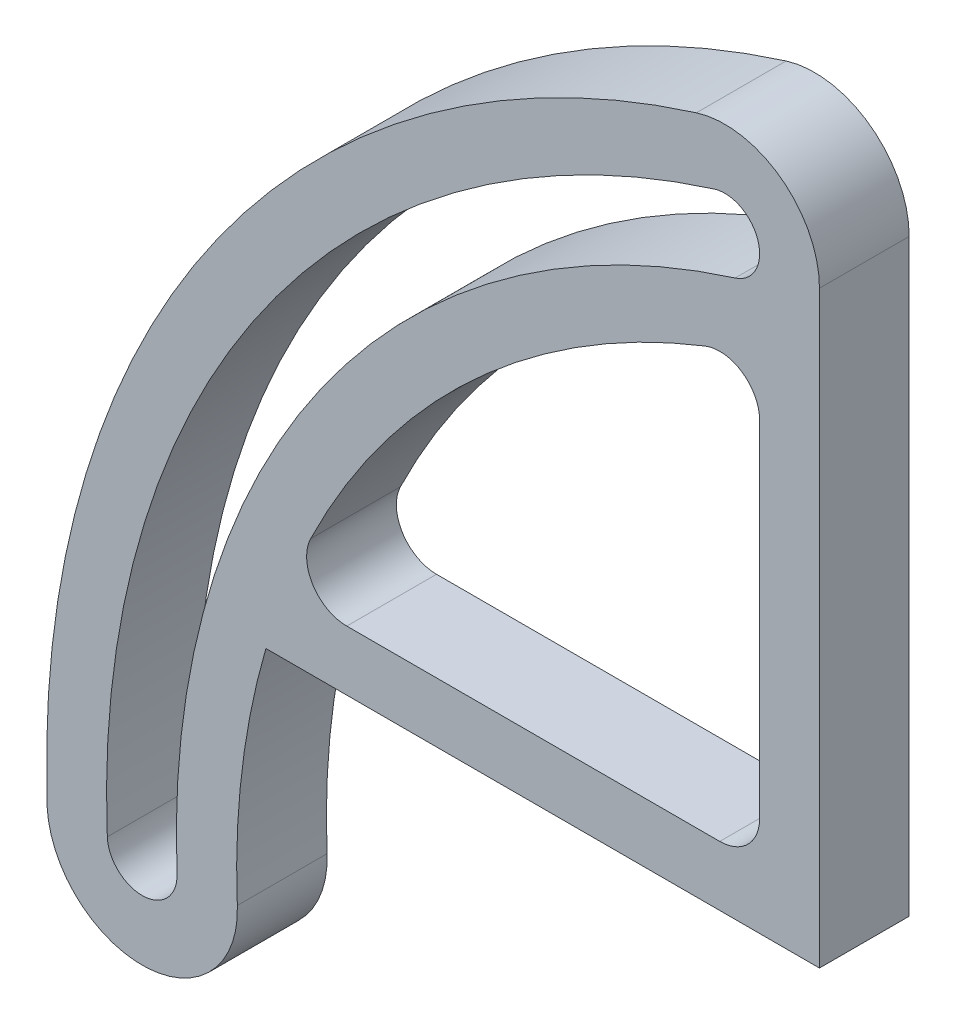
ISO-10303-21;
HEADER;
FILE_DESCRIPTION(('STEP AP214'),'2;1');
FILE_NAME('part.step','',(''),(''),'','','');
FILE_SCHEMA(('AUTOMOTIVE_DESIGN { 1 0 10303 214 1 1 1 1 }'));
ENDSEC;
DATA;
#1=APPLICATION_CONTEXT('core data for automotive mechanical design processes');
#2=APPLICATION_PROTOCOL_DEFINITION('international standard','automotive_design',2000,#1);
#3=PRODUCT_CONTEXT('',#1,'mechanical');
#4=PRODUCT('Part','Part','',(#3));
#5=PRODUCT_RELATED_PRODUCT_CATEGORY('part','',(#4));
#6=PRODUCT_DEFINITION_FORMATION('','',#4);
#7=PRODUCT_DEFINITION_CONTEXT('part definition',#1,'design');
#8=PRODUCT_DEFINITION('design','',#6,#7);
#9=PRODUCT_DEFINITION_SHAPE('','',#8);
#10=(LENGTH_UNIT() NAMED_UNIT(*) SI_UNIT(.MILLI.,.METRE.));
#11=(NAMED_UNIT(*) PLANE_ANGLE_UNIT() SI_UNIT($,.RADIAN.));
#12=(NAMED_UNIT(*) SI_UNIT($,.STERADIAN.) SOLID_ANGLE_UNIT());
#13=UNCERTAINTY_MEASURE_WITH_UNIT(LENGTH_MEASURE(1.E-05),#10,'distance_accuracy_value','');
#14=(GEOMETRIC_REPRESENTATION_CONTEXT(3) GLOBAL_UNCERTAINTY_ASSIGNED_CONTEXT((#13)) GLOBAL_UNIT_ASSIGNED_CONTEXT((#10,
#11,#12)) REPRESENTATION_CONTEXT('',''));
#15=CARTESIAN_POINT('',(0.,0.,0.));
#16=DIRECTION('',(0.,0.,1.));
#17=DIRECTION('',(1.,0.,0.));
#18=AXIS2_PLACEMENT_3D('',#15,#16,#17);
#19=CARTESIAN_POINT('',(20.3719546178411,28.3749310452198,4.5));
#20=DIRECTION('',(0.,0.,-1.));
#21=DIRECTION('',(-1.,0.,0.));
#22=AXIS2_PLACEMENT_3D('',#19,#20,#21);
#23=PLANE('',#22);
#24=CARTESIAN_POINT('',(20.1219546178411,21.135325995132,4.5));
#25=DIRECTION('',(0.,0.,1.));
#26=DIRECTION('',(1.,0.,0.));
#27=AXIS2_PLACEMENT_3D('',#24,#25,#26);
#28=CIRCLE('',#27,2.);
#29=CARTESIAN_POINT('',(22.1219546178411,21.135325995132,4.5));
#30=VERTEX_POINT('',#29);
#31=CARTESIAN_POINT('',(19.3934936859439,22.9979436882454,4.5));
#32=VERTEX_POINT('',#31);
#33=EDGE_CURVE('E284',#30,#32,#28,.T.);
#34=ORIENTED_EDGE('',*,*,#33,.F.);
#35=DIRECTION('',(0.,-1.,0.));
#36=VECTOR('',#35,1.);
#37=CARTESIAN_POINT('',(22.1219546178411,21.135325995132,4.5));
#38=LINE('',#37,#36);
#39=CARTESIAN_POINT('',(22.1219546178411,3.85063193482578,4.5));
#40=VERTEX_POINT('',#39);
#41=EDGE_CURVE('E296',#30,#40,#38,.T.);
#42=ORIENTED_EDGE('',*,*,#41,.T.);
#43=CARTESIAN_POINT('',(20.1219546178411,3.85063193482578,4.5));
#44=DIRECTION('',(0.,0.,-1.));
#45=DIRECTION('',(-1.,0.,0.));
#46=AXIS2_PLACEMENT_3D('',#43,#44,#45);
#47=CIRCLE('',#46,2.);
#48=CARTESIAN_POINT('',(20.1219546178411,1.85063193482578,4.5));
#49=VERTEX_POINT('',#48);
#50=EDGE_CURVE('E293',#40,#49,#47,.T.);
#51=ORIENTED_EDGE('',*,*,#50,.T.);
#52=DIRECTION('',(1.,0.,0.));
#53=VECTOR('',#52,1.);
#54=CARTESIAN_POINT('',(1.41909826932998,1.85063193482578,4.5));
#55=LINE('',#54,#53);
#56=CARTESIAN_POINT('',(1.41909826932998,1.85063193482578,4.5));
#57=VERTEX_POINT('',#56);
#58=EDGE_CURVE('E291',#57,#49,#55,.T.);
#59=ORIENTED_EDGE('',*,*,#58,.F.);
#60=CARTESIAN_POINT('',(1.41909826932998,3.86410021504708,4.5));
#61=DIRECTION('',(0.,0.,1.));
#62=DIRECTION('',(1.,0.,0.));
#63=AXIS2_PLACEMENT_3D('',#60,#61,#62);
#64=CIRCLE('',#63,2.0134682802213);
#65=CARTESIAN_POINT('',(-0.390986111950413,4.74594433284914,4.5));
#66=VERTEX_POINT('',#65);
#67=EDGE_CURVE('E289',#66,#57,#64,.T.);
#68=ORIENTED_EDGE('',*,*,#67,.F.);
#69=CARTESIAN_POINT('',(32.8689589116018,-11.4577681463958,4.5));
#70=DIRECTION('',(0.,0.,1.));
#71=DIRECTION('',(1.,0.,0.));
#72=AXIS2_PLACEMENT_3D('',#69,#70,#71);
#73=CIRCLE('',#72,36.997084224027);
#74=EDGE_CURVE('E286',#32,#66,#73,.T.);
#75=ORIENTED_EDGE('',*,*,#74,.F.);
#76=EDGE_LOOP('',(#34,#42,#51,#59,#68,#75));
#77=FACE_BOUND('',#76,.T.);
#78=CARTESIAN_POINT('',(20.3719546178411,28.3749310452198,4.5));
#79=DIRECTION('',(0.,0.,-1.));
#80=DIRECTION('',(-1.,0.,0.));
#81=AXIS2_PLACEMENT_3D('',#78,#79,#80);
#82=CIRCLE('',#81,4.74999999999999);
#83=CARTESIAN_POINT('',(18.9500404530862,32.9071115478111,4.5));
#84=VERTEX_POINT('',#83);
#85=CARTESIAN_POINT('',(25.1219546178411,28.3749310452198,4.5));
#86=VERTEX_POINT('',#85);
#87=EDGE_CURVE('E330',#84,#86,#82,.T.);
#88=ORIENTED_EDGE('',*,*,#87,.F.);
#89=CARTESIAN_POINT('',(32.8689589116018,-11.4577681463958,4.5));
#90=DIRECTION('',(0.,0.,1.));
#91=DIRECTION('',(1.,0.,0.));
#92=AXIS2_PLACEMENT_3D('',#89,#90,#91);
#93=CIRCLE('',#92,46.497084224027);
#94=CARTESIAN_POINT('',(-13.6052997832807,-12.9145179867629,4.5));
#95=VERTEX_POINT('',#94);
#96=EDGE_CURVE('E344',#84,#95,#93,.T.);
#97=ORIENTED_EDGE('',*,*,#96,.T.);
#98=CARTESIAN_POINT('',(-8.84046149044971,-13.230701008334,4.5));
#99=DIRECTION('',(0.,0.,1.));
#100=DIRECTION('',(1.,0.,0.));
#101=AXIS2_PLACEMENT_3D('',#98,#99,#100);
#102=CIRCLE('',#101,4.77531733604774);
#103=CARTESIAN_POINT('',(-4.06945240024389,-13.027900808305,4.5));
#104=VERTEX_POINT('',#103);
#105=EDGE_CURVE('E342',#95,#104,#102,.T.);
#106=ORIENTED_EDGE('',*,*,#105,.T.);
#107=CARTESIAN_POINT('',(32.8689589116018,-11.4577681463958,4.5));
#108=DIRECTION('',(0.,0.,1.));
#109=DIRECTION('',(1.,0.,0.));
#110=AXIS2_PLACEMENT_3D('',#107,#108,#109);
#111=CIRCLE('',#110,36.9717668879793);
#112=CARTESIAN_POINT('',(-2.63665239963399,-1.14936806517422,4.5));
#113=VERTEX_POINT('',#112);
#114=EDGE_CURVE('E339',#113,#104,#111,.T.);
#115=ORIENTED_EDGE('',*,*,#114,.F.);
#116=DIRECTION('',(1.,0.,0.));
#117=VECTOR('',#116,1.);
#118=CARTESIAN_POINT('',(-2.63665239963399,-1.14936806517422,4.5));
#119=LINE('',#118,#117);
#120=CARTESIAN_POINT('',(25.1219546178411,-1.14936806517422,4.5));
#121=VERTEX_POINT('',#120);
#122=EDGE_CURVE('E337',#113,#121,#119,.T.);
#123=ORIENTED_EDGE('',*,*,#122,.T.);
#124=DIRECTION('',(0.,-1.,0.));
#125=VECTOR('',#124,1.);
#126=CARTESIAN_POINT('',(25.1219546178411,28.3749310452198,4.5));
#127=LINE('',#126,#125);
#128=EDGE_CURVE('E333',#86,#121,#127,.T.);
#129=ORIENTED_EDGE('',*,*,#128,.F.);
#130=EDGE_LOOP('',(#88,#97,#106,#115,#123,#129));
#131=FACE_BOUND('',#130,.T.);
#132=CARTESIAN_POINT('',(20.3719546178411,28.3749310452198,4.5));
#133=DIRECTION('',(0.,0.,1.));
#134=DIRECTION('',(1.,0.,0.));
#135=AXIS2_PLACEMENT_3D('',#132,#133,#134);
#136=CIRCLE('',#135,1.74999999999999);
#137=CARTESIAN_POINT('',(20.8958177311719,26.7051803337388,4.5));
#138=VERTEX_POINT('',#137);
#139=CARTESIAN_POINT('',(19.8480915045104,30.0446817567008,4.5));
#140=VERTEX_POINT('',#139);
#141=EDGE_CURVE('E249',#138,#140,#136,.T.);
#142=ORIENTED_EDGE('',*,*,#141,.F.);
#143=CARTESIAN_POINT('',(32.8689589116018,-11.4577681463958,4.5));
#144=DIRECTION('',(0.,0.,1.));
#145=DIRECTION('',(1.,0.,0.));
#146=AXIS2_PLACEMENT_3D('',#143,#144,#145);
#147=CIRCLE('',#146,39.997084224027);
#148=CARTESIAN_POINT('',(-7.09204032379059,-13.1563812668224,4.5));
#149=VERTEX_POINT('',#148);
#150=EDGE_CURVE('E271',#138,#149,#147,.T.);
#151=ORIENTED_EDGE('',*,*,#150,.T.);
#152=CARTESIAN_POINT('',(-8.84046149044971,-13.230701008334,4.5));
#153=DIRECTION('',(0.,0.,1.));
#154=DIRECTION('',(1.,0.,0.));
#155=AXIS2_PLACEMENT_3D('',#152,#153,#154);
#156=CIRCLE('',#155,1.74999999999999);
#157=CARTESIAN_POINT('',(-10.5888826571088,-13.3050207498456,4.5));
#158=VERTEX_POINT('',#157);
#159=EDGE_CURVE('E269',#158,#149,#156,.T.);
#160=ORIENTED_EDGE('',*,*,#159,.F.);
#161=CARTESIAN_POINT('',(32.8689589116018,-11.4577681463958,4.5));
#162=DIRECTION('',(0.,0.,1.));
#163=DIRECTION('',(1.,0.,0.));
#164=AXIS2_PLACEMENT_3D('',#161,#162,#163);
#165=CIRCLE('',#164,43.497084224027);
#166=EDGE_CURVE('E257',#140,#158,#165,.T.);
#167=ORIENTED_EDGE('',*,*,#166,.F.);
#168=EDGE_LOOP('',(#142,#151,#160,#167));
#169=FACE_BOUND('',#168,.T.);
#170=ADVANCED_FACE('F135',(#77,#131,#169),#23,.F.);
#171=CARTESIAN_POINT('',(20.3719546178411,28.3749310452198,0.));
#172=DIRECTION('',(0.,0.,-1.));
#173=DIRECTION('',(-1.,0.,0.));
#174=AXIS2_PLACEMENT_3D('',#171,#172,#173);
#175=PLANE('',#174);
#176=CARTESIAN_POINT('',(20.3719546178411,28.3749310452198,0.));
#177=DIRECTION('',(0.,0.,-1.));
#178=DIRECTION('',(-1.,0.,0.));
#179=AXIS2_PLACEMENT_3D('',#176,#177,#178);
#180=CIRCLE('',#179,4.74999999999999);
#181=CARTESIAN_POINT('',(18.9500404530862,32.9071115478111,0.));
#182=VERTEX_POINT('',#181);
#183=CARTESIAN_POINT('',(25.1219546178411,28.3749310452198,0.));
#184=VERTEX_POINT('',#183);
#185=EDGE_CURVE('E329',#182,#184,#180,.T.);
#186=ORIENTED_EDGE('',*,*,#185,.T.);
#187=DIRECTION('',(0.,-1.,0.));
#188=VECTOR('',#187,1.);
#189=CARTESIAN_POINT('',(25.1219546178411,28.3749310452198,0.));
#190=LINE('',#189,#188);
#191=CARTESIAN_POINT('',(25.1219546178411,-1.14936806517422,0.));
#192=VERTEX_POINT('',#191);
#193=EDGE_CURVE('E348',#184,#192,#190,.T.);
#194=ORIENTED_EDGE('',*,*,#193,.T.);
#195=DIRECTION('',(1.,0.,0.));
#196=VECTOR('',#195,1.);
#197=CARTESIAN_POINT('',(-2.63665239963399,-1.14936806517422,0.));
#198=LINE('',#197,#196);
#199=CARTESIAN_POINT('',(-2.63665239963399,-1.14936806517422,0.));
#200=VERTEX_POINT('',#199);
#201=EDGE_CURVE('E351',#200,#192,#198,.T.);
#202=ORIENTED_EDGE('',*,*,#201,.F.);
#203=CARTESIAN_POINT('',(32.8689589116018,-11.4577681463958,0.));
#204=DIRECTION('',(0.,0.,1.));
#205=DIRECTION('',(1.,0.,0.));
#206=AXIS2_PLACEMENT_3D('',#203,#204,#205);
#207=CIRCLE('',#206,36.9717668879793);
#208=CARTESIAN_POINT('',(-4.06945240024389,-13.027900808305,0.));
#209=VERTEX_POINT('',#208);
#210=EDGE_CURVE('E354',#200,#209,#207,.T.);
#211=ORIENTED_EDGE('',*,*,#210,.T.);
#212=CARTESIAN_POINT('',(-8.84046149044971,-13.230701008334,0.));
#213=DIRECTION('',(0.,0.,1.));
#214=DIRECTION('',(1.,0.,0.));
#215=AXIS2_PLACEMENT_3D('',#212,#213,#214);
#216=CIRCLE('',#215,4.77531733604774);
#217=CARTESIAN_POINT('',(-13.6052997832807,-12.9145179867629,0.));
#218=VERTEX_POINT('',#217);
#219=EDGE_CURVE('E357',#218,#209,#216,.T.);
#220=ORIENTED_EDGE('',*,*,#219,.F.);
#221=CARTESIAN_POINT('',(32.8689589116018,-11.4577681463958,0.));
#222=DIRECTION('',(0.,0.,1.));
#223=DIRECTION('',(1.,0.,0.));
#224=AXIS2_PLACEMENT_3D('',#221,#222,#223);
#225=CIRCLE('',#224,46.497084224027);
#226=EDGE_CURVE('E334',#182,#218,#225,.T.);
#227=ORIENTED_EDGE('',*,*,#226,.F.);
#228=EDGE_LOOP('',(#186,#194,#202,#211,#220,#227));
#229=FACE_BOUND('',#228,.T.);
#230=DIRECTION('',(0.,-1.,0.));
#231=VECTOR('',#230,1.);
#232=CARTESIAN_POINT('',(22.1219546178411,21.135325995132,0.));
#233=LINE('',#232,#231);
#234=CARTESIAN_POINT('',(22.1219546178411,21.135325995132,0.));
#235=VERTEX_POINT('',#234);
#236=CARTESIAN_POINT('',(22.1219546178411,3.85063193482578,0.));
#237=VERTEX_POINT('',#236);
#238=EDGE_CURVE('E287',#235,#237,#233,.T.);
#239=ORIENTED_EDGE('',*,*,#238,.F.);
#240=CARTESIAN_POINT('',(20.1219546178411,21.135325995132,0.));
#241=DIRECTION('',(0.,0.,1.));
#242=DIRECTION('',(1.,0.,0.));
#243=AXIS2_PLACEMENT_3D('',#240,#241,#242);
#244=CIRCLE('',#243,2.);
#245=CARTESIAN_POINT('',(19.3934936859439,22.9979436882454,0.));
#246=VERTEX_POINT('',#245);
#247=EDGE_CURVE('E265',#235,#246,#244,.T.);
#248=ORIENTED_EDGE('',*,*,#247,.T.);
#249=CARTESIAN_POINT('',(32.8689589116018,-11.4577681463958,0.));
#250=DIRECTION('',(0.,0.,1.));
#251=DIRECTION('',(1.,0.,0.));
#252=AXIS2_PLACEMENT_3D('',#249,#250,#251);
#253=CIRCLE('',#252,36.997084224027);
#254=CARTESIAN_POINT('',(-0.390986111950413,4.74594433284914,0.));
#255=VERTEX_POINT('',#254);
#256=EDGE_CURVE('E302',#246,#255,#253,.T.);
#257=ORIENTED_EDGE('',*,*,#256,.T.);
#258=CARTESIAN_POINT('',(1.41909826932998,3.86410021504708,0.));
#259=DIRECTION('',(0.,0.,1.));
#260=DIRECTION('',(1.,0.,0.));
#261=AXIS2_PLACEMENT_3D('',#258,#259,#260);
#262=CIRCLE('',#261,2.0134682802213);
#263=CARTESIAN_POINT('',(1.41909826932998,1.85063193482578,0.));
#264=VERTEX_POINT('',#263);
#265=EDGE_CURVE('E305',#255,#264,#262,.T.);
#266=ORIENTED_EDGE('',*,*,#265,.T.);
#267=DIRECTION('',(1.,0.,0.));
#268=VECTOR('',#267,1.);
#269=CARTESIAN_POINT('',(1.41909826932998,1.85063193482578,0.));
#270=LINE('',#269,#268);
#271=CARTESIAN_POINT('',(20.1219546178411,1.85063193482578,0.));
#272=VERTEX_POINT('',#271);
#273=EDGE_CURVE('E308',#264,#272,#270,.T.);
#274=ORIENTED_EDGE('',*,*,#273,.T.);
#275=CARTESIAN_POINT('',(20.1219546178411,3.85063193482578,0.));
#276=DIRECTION('',(0.,0.,-1.));
#277=DIRECTION('',(-1.,0.,0.));
#278=AXIS2_PLACEMENT_3D('',#275,#276,#277);
#279=CIRCLE('',#278,2.);
#280=EDGE_CURVE('E311',#237,#272,#279,.T.);
#281=ORIENTED_EDGE('',*,*,#280,.F.);
#282=EDGE_LOOP('',(#239,#248,#257,#266,#274,#281));
#283=FACE_BOUND('',#282,.T.);
#284=CARTESIAN_POINT('',(32.8689589116018,-11.4577681463958,0.));
#285=DIRECTION('',(0.,0.,1.));
#286=DIRECTION('',(1.,0.,0.));
#287=AXIS2_PLACEMENT_3D('',#284,#285,#286);
#288=CIRCLE('',#287,39.997084224027);
#289=CARTESIAN_POINT('',(20.8958177311719,26.7051803337388,0.));
#290=VERTEX_POINT('',#289);
#291=CARTESIAN_POINT('',(-7.09204032379059,-13.1563812668224,0.));
#292=VERTEX_POINT('',#291);
#293=EDGE_CURVE('E258',#290,#292,#288,.T.);
#294=ORIENTED_EDGE('',*,*,#293,.F.);
#295=CARTESIAN_POINT('',(20.3719546178411,28.3749310452198,0.));
#296=DIRECTION('',(0.,0.,1.));
#297=DIRECTION('',(1.,0.,0.));
#298=AXIS2_PLACEMENT_3D('',#295,#296,#297);
#299=CIRCLE('',#298,1.74999999999999);
#300=CARTESIAN_POINT('',(19.8480915045104,30.0446817567008,0.));
#301=VERTEX_POINT('',#300);
#302=EDGE_CURVE('E160',#290,#301,#299,.T.);
#303=ORIENTED_EDGE('',*,*,#302,.T.);
#304=CARTESIAN_POINT('',(32.8689589116018,-11.4577681463958,0.));
#305=DIRECTION('',(0.,0.,1.));
#306=DIRECTION('',(1.,0.,0.));
#307=AXIS2_PLACEMENT_3D('',#304,#305,#306);
#308=CIRCLE('',#307,43.497084224027);
#309=CARTESIAN_POINT('',(-10.5888826571088,-13.3050207498456,0.));
#310=VERTEX_POINT('',#309);
#311=EDGE_CURVE('E264',#301,#310,#308,.T.);
#312=ORIENTED_EDGE('',*,*,#311,.T.);
#313=CARTESIAN_POINT('',(-8.84046149044971,-13.230701008334,0.));
#314=DIRECTION('',(0.,0.,1.));
#315=DIRECTION('',(1.,0.,0.));
#316=AXIS2_PLACEMENT_3D('',#313,#314,#315);
#317=CIRCLE('',#316,1.74999999999999);
#318=EDGE_CURVE('E277',#310,#292,#317,.T.);
#319=ORIENTED_EDGE('',*,*,#318,.T.);
#320=EDGE_LOOP('',(#294,#303,#312,#319));
#321=FACE_BOUND('',#320,.T.);
#322=ADVANCED_FACE('F378',(#229,#283,#321),#175,.T.);
#323=CARTESIAN_POINT('',(20.3719546178411,28.3749310452198,4.5));
#324=DIRECTION('',(0.,0.,-1.));
#325=DIRECTION('',(-1.,0.,0.));
#326=AXIS2_PLACEMENT_3D('',#323,#324,#325);
#327=CYLINDRICAL_SURFACE('',#326,4.74999999999999);
#328=ORIENTED_EDGE('',*,*,#185,.F.);
#329=DIRECTION('',(0.,0.,-1.));
#330=VECTOR('',#329,1.);
#331=CARTESIAN_POINT('',(18.9500404530862,32.9071115478111,4.5));
#332=LINE('',#331,#330);
#333=EDGE_CURVE('E12',#84,#182,#332,.T.);
#334=ORIENTED_EDGE('',*,*,#333,.F.);
#335=ORIENTED_EDGE('',*,*,#87,.T.);
#336=DIRECTION('',(0.,0.,-1.));
#337=VECTOR('',#336,1.);
#338=CARTESIAN_POINT('',(25.1219546178411,28.3749310452198,4.5));
#339=LINE('',#338,#337);
#340=EDGE_CURVE('E139',#86,#184,#339,.T.);
#341=ORIENTED_EDGE('',*,*,#340,.T.);
#342=EDGE_LOOP('',(#328,#334,#335,#341));
#343=FACE_BOUND('',#342,.T.);
#344=ADVANCED_FACE('F137',(#343),#327,.T.);
#345=CARTESIAN_POINT('',(32.8689589116018,-11.4577681463958,4.5));
#346=DIRECTION('',(0.,0.,-1.));
#347=DIRECTION('',(-1.,0.,0.));
#348=AXIS2_PLACEMENT_3D('',#345,#346,#347);
#349=CYLINDRICAL_SURFACE('',#348,46.497084224027);
#350=ORIENTED_EDGE('',*,*,#226,.T.);
#351=DIRECTION('',(0.,0.,-1.));
#352=VECTOR('',#351,1.);
#353=CARTESIAN_POINT('',(-13.6052997832807,-12.9145179867629,4.5));
#354=LINE('',#353,#352);
#355=EDGE_CURVE('E144',#95,#218,#354,.T.);
#356=ORIENTED_EDGE('',*,*,#355,.F.);
#357=ORIENTED_EDGE('',*,*,#96,.F.);
#358=ORIENTED_EDGE('',*,*,#333,.T.);
#359=EDGE_LOOP('',(#350,#356,#357,#358));
#360=FACE_BOUND('',#359,.T.);
#361=ADVANCED_FACE('F383',(#360),#349,.T.);
#362=CARTESIAN_POINT('',(-8.84046149044971,-13.230701008334,4.5));
#363=DIRECTION('',(0.,0.,-1.));
#364=DIRECTION('',(-1.,0.,0.));
#365=AXIS2_PLACEMENT_3D('',#362,#363,#364);
#366=CYLINDRICAL_SURFACE('',#365,4.77531733604774);
#367=ORIENTED_EDGE('',*,*,#219,.T.);
#368=DIRECTION('',(0.,0.,-1.));
#369=VECTOR('',#368,1.);
#370=CARTESIAN_POINT('',(-4.06945240024389,-13.027900808305,4.5));
#371=LINE('',#370,#369);
#372=EDGE_CURVE('E363',#104,#209,#371,.T.);
#373=ORIENTED_EDGE('',*,*,#372,.F.);
#374=ORIENTED_EDGE('',*,*,#105,.F.);
#375=ORIENTED_EDGE('',*,*,#355,.T.);
#376=EDGE_LOOP('',(#367,#373,#374,#375));
#377=FACE_BOUND('',#376,.T.);
#378=ADVANCED_FACE('F387',(#377),#366,.T.);
#379=CARTESIAN_POINT('',(32.8689589116018,-11.4577681463958,4.5));
#380=DIRECTION('',(0.,0.,-1.));
#381=DIRECTION('',(-1.,0.,0.));
#382=AXIS2_PLACEMENT_3D('',#379,#380,#381);
#383=CYLINDRICAL_SURFACE('',#382,36.9717668879793);
#384=ORIENTED_EDGE('',*,*,#210,.F.);
#385=DIRECTION('',(0.,0.,-1.));
#386=VECTOR('',#385,1.);
#387=CARTESIAN_POINT('',(-2.63665239963399,-1.14936806517422,4.5));
#388=LINE('',#387,#386);
#389=EDGE_CURVE('E365',#113,#200,#388,.T.);
#390=ORIENTED_EDGE('',*,*,#389,.F.);
#391=ORIENTED_EDGE('',*,*,#114,.T.);
#392=ORIENTED_EDGE('',*,*,#372,.T.);
#393=EDGE_LOOP('',(#384,#390,#391,#392));
#394=FACE_BOUND('',#393,.T.);
#395=ADVANCED_FACE('F396',(#394),#383,.F.);
#396=CARTESIAN_POINT('',(-2.63665239963399,-1.14936806517422,4.5));
#397=DIRECTION('',(0.,1.,0.));
#398=DIRECTION('',(-1.,0.,0.));
#399=AXIS2_PLACEMENT_3D('',#396,#397,#398);
#400=PLANE('',#399);
#401=ORIENTED_EDGE('',*,*,#201,.T.);
#402=DIRECTION('',(0.,0.,-1.));
#403=VECTOR('',#402,1.);
#404=CARTESIAN_POINT('',(25.1219546178411,-1.14936806517422,4.5));
#405=LINE('',#404,#403);
#406=EDGE_CURVE('E366',#121,#192,#405,.T.);
#407=ORIENTED_EDGE('',*,*,#406,.F.);
#408=ORIENTED_EDGE('',*,*,#122,.F.);
#409=ORIENTED_EDGE('',*,*,#389,.T.);
#410=EDGE_LOOP('',(#401,#407,#408,#409));
#411=FACE_BOUND('',#410,.T.);
#412=ADVANCED_FACE('F393',(#411),#400,.F.);
#413=CARTESIAN_POINT('',(25.1219546178411,28.3749310452198,4.5));
#414=DIRECTION('',(1.,0.,0.));
#415=DIRECTION('',(0.,1.,0.));
#416=AXIS2_PLACEMENT_3D('',#413,#414,#415);
#417=PLANE('',#416);
#418=ORIENTED_EDGE('',*,*,#193,.F.);
#419=ORIENTED_EDGE('',*,*,#340,.F.);
#420=ORIENTED_EDGE('',*,*,#128,.T.);
#421=ORIENTED_EDGE('',*,*,#406,.T.);
#422=EDGE_LOOP('',(#418,#419,#420,#421));
#423=FACE_BOUND('',#422,.T.);
#424=ADVANCED_FACE('F374',(#423),#417,.T.);
#425=CARTESIAN_POINT('',(20.1219546178411,21.135325995132,4.5));
#426=DIRECTION('',(0.,0.,-1.));
#427=DIRECTION('',(-1.,0.,0.));
#428=AXIS2_PLACEMENT_3D('',#425,#426,#427);
#429=CYLINDRICAL_SURFACE('',#428,2.);
#430=ORIENTED_EDGE('',*,*,#247,.F.);
#431=DIRECTION('',(0.,0.,-1.));
#432=VECTOR('',#431,1.);
#433=CARTESIAN_POINT('',(22.1219546178411,21.135325995132,4.5));
#434=LINE('',#433,#432);
#435=EDGE_CURVE('E299',#30,#235,#434,.T.);
#436=ORIENTED_EDGE('',*,*,#435,.F.);
#437=ORIENTED_EDGE('',*,*,#33,.T.);
#438=DIRECTION('',(0.,0.,-1.));
#439=VECTOR('',#438,1.);
#440=CARTESIAN_POINT('',(19.3934936859439,22.9979436882454,4.5));
#441=LINE('',#440,#439);
#442=EDGE_CURVE('E326',#32,#246,#441,.T.);
#443=ORIENTED_EDGE('',*,*,#442,.T.);
#444=EDGE_LOOP('',(#430,#436,#437,#443));
#445=FACE_BOUND('',#444,.T.);
#446=ADVANCED_FACE('F414',(#445),#429,.F.);
#447=CARTESIAN_POINT('',(32.8689589116018,-11.4577681463958,4.5));
#448=DIRECTION('',(0.,0.,-1.));
#449=DIRECTION('',(-1.,0.,0.));
#450=AXIS2_PLACEMENT_3D('',#447,#448,#449);
#451=CYLINDRICAL_SURFACE('',#450,36.997084224027);
#452=ORIENTED_EDGE('',*,*,#256,.F.);
#453=ORIENTED_EDGE('',*,*,#442,.F.);
#454=ORIENTED_EDGE('',*,*,#74,.T.);
#455=DIRECTION('',(0.,0.,-1.));
#456=VECTOR('',#455,1.);
#457=CARTESIAN_POINT('',(-0.390986111950413,4.74594433284914,4.5));
#458=LINE('',#457,#456);
#459=EDGE_CURVE('E324',#66,#255,#458,.T.);
#460=ORIENTED_EDGE('',*,*,#459,.T.);
#461=EDGE_LOOP('',(#452,#453,#454,#460));
#462=FACE_BOUND('',#461,.T.);
#463=ADVANCED_FACE('F466',(#462),#451,.F.);
#464=CARTESIAN_POINT('',(1.41909826932998,3.86410021504708,4.5));
#465=DIRECTION('',(0.,0.,-1.));
#466=DIRECTION('',(-1.,0.,0.));
#467=AXIS2_PLACEMENT_3D('',#464,#465,#466);
#468=CYLINDRICAL_SURFACE('',#467,2.0134682802213);
#469=ORIENTED_EDGE('',*,*,#265,.F.);
#470=ORIENTED_EDGE('',*,*,#459,.F.);
#471=ORIENTED_EDGE('',*,*,#67,.T.);
#472=DIRECTION('',(0.,0.,-1.));
#473=VECTOR('',#472,1.);
#474=CARTESIAN_POINT('',(1.41909826932998,1.85063193482578,4.5));
#475=LINE('',#474,#473);
#476=EDGE_CURVE('E322',#57,#264,#475,.T.);
#477=ORIENTED_EDGE('',*,*,#476,.T.);
#478=EDGE_LOOP('',(#469,#470,#471,#477));
#479=FACE_BOUND('',#478,.T.);
#480=ADVANCED_FACE('F474',(#479),#468,.F.);
#481=CARTESIAN_POINT('',(1.41909826932998,1.85063193482578,4.5));
#482=DIRECTION('',(0.,1.,0.));
#483=DIRECTION('',(0.,0.,1.));
#484=AXIS2_PLACEMENT_3D('',#481,#482,#483);
#485=PLANE('',#484);
#486=ORIENTED_EDGE('',*,*,#273,.F.);
#487=ORIENTED_EDGE('',*,*,#476,.F.);
#488=ORIENTED_EDGE('',*,*,#58,.T.);
#489=DIRECTION('',(0.,0.,-1.));
#490=VECTOR('',#489,1.);
#491=CARTESIAN_POINT('',(20.1219546178411,1.85063193482578,4.5));
#492=LINE('',#491,#490);
#493=EDGE_CURVE('E320',#49,#272,#492,.T.);
#494=ORIENTED_EDGE('',*,*,#493,.T.);
#495=EDGE_LOOP('',(#486,#487,#488,#494));
#496=FACE_BOUND('',#495,.T.);
#497=ADVANCED_FACE('F482',(#496),#485,.T.);
#498=CARTESIAN_POINT('',(20.1219546178411,3.85063193482578,4.5));
#499=DIRECTION('',(0.,0.,-1.));
#500=DIRECTION('',(-1.,0.,0.));
#501=AXIS2_PLACEMENT_3D('',#498,#499,#500);
#502=CYLINDRICAL_SURFACE('',#501,2.);
#503=ORIENTED_EDGE('',*,*,#280,.T.);
#504=ORIENTED_EDGE('',*,*,#493,.F.);
#505=ORIENTED_EDGE('',*,*,#50,.F.);
#506=DIRECTION('',(0.,0.,-1.));
#507=VECTOR('',#506,1.);
#508=CARTESIAN_POINT('',(22.1219546178411,3.85063193482578,4.5));
#509=LINE('',#508,#507);
#510=EDGE_CURVE('E318',#40,#237,#509,.T.);
#511=ORIENTED_EDGE('',*,*,#510,.T.);
#512=EDGE_LOOP('',(#503,#504,#505,#511));
#513=FACE_BOUND('',#512,.T.);
#514=ADVANCED_FACE('F491',(#513),#502,.F.);
#515=CARTESIAN_POINT('',(22.1219546178411,21.135325995132,4.5));
#516=DIRECTION('',(1.,0.,0.));
#517=DIRECTION('',(0.,1.,0.));
#518=AXIS2_PLACEMENT_3D('',#515,#516,#517);
#519=PLANE('',#518);
#520=ORIENTED_EDGE('',*,*,#238,.T.);
#521=ORIENTED_EDGE('',*,*,#510,.F.);
#522=ORIENTED_EDGE('',*,*,#41,.F.);
#523=ORIENTED_EDGE('',*,*,#435,.T.);
#524=EDGE_LOOP('',(#520,#521,#522,#523));
#525=FACE_BOUND('',#524,.T.);
#526=ADVANCED_FACE('F500',(#525),#519,.F.);
#527=CARTESIAN_POINT('',(20.3719546178411,28.3749310452198,4.5));
#528=DIRECTION('',(0.,0.,-1.));
#529=DIRECTION('',(-1.,0.,0.));
#530=AXIS2_PLACEMENT_3D('',#527,#528,#529);
#531=CYLINDRICAL_SURFACE('',#530,1.74999999999999);
#532=ORIENTED_EDGE('',*,*,#302,.F.);
#533=DIRECTION('',(0.,0.,-1.));
#534=VECTOR('',#533,1.);
#535=CARTESIAN_POINT('',(20.8958177311719,26.7051803337388,4.5));
#536=LINE('',#535,#534);
#537=EDGE_CURVE('E253',#138,#290,#536,.T.);
#538=ORIENTED_EDGE('',*,*,#537,.F.);
#539=ORIENTED_EDGE('',*,*,#141,.T.);
#540=DIRECTION('',(0.,0.,-1.));
#541=VECTOR('',#540,1.);
#542=CARTESIAN_POINT('',(19.8480915045104,30.0446817567008,4.5));
#543=LINE('',#542,#541);
#544=EDGE_CURVE('E252',#140,#301,#543,.T.);
#545=ORIENTED_EDGE('',*,*,#544,.T.);
#546=EDGE_LOOP('',(#532,#538,#539,#545));
#547=FACE_BOUND('',#546,.T.);
#548=ADVANCED_FACE('F251',(#547),#531,.F.);
#549=CARTESIAN_POINT('',(32.8689589116018,-11.4577681463958,4.5));
#550=DIRECTION('',(0.,0.,-1.));
#551=DIRECTION('',(-1.,0.,0.));
#552=AXIS2_PLACEMENT_3D('',#549,#550,#551);
#553=CYLINDRICAL_SURFACE('',#552,43.497084224027);
#554=ORIENTED_EDGE('',*,*,#311,.F.);
#555=ORIENTED_EDGE('',*,*,#544,.F.);
#556=ORIENTED_EDGE('',*,*,#166,.T.);
#557=DIRECTION('',(0.,0.,-1.));
#558=VECTOR('',#557,1.);
#559=CARTESIAN_POINT('',(-10.5888826571088,-13.3050207498456,4.5));
#560=LINE('',#559,#558);
#561=EDGE_CURVE('E266',#158,#310,#560,.T.);
#562=ORIENTED_EDGE('',*,*,#561,.T.);
#563=EDGE_LOOP('',(#554,#555,#556,#562));
#564=FACE_BOUND('',#563,.T.);
#565=ADVANCED_FACE('F261',(#564),#553,.F.);
#566=CARTESIAN_POINT('',(-8.84046149044971,-13.230701008334,4.5));
#567=DIRECTION('',(0.,0.,-1.));
#568=DIRECTION('',(-1.,0.,0.));
#569=AXIS2_PLACEMENT_3D('',#566,#567,#568);
#570=CYLINDRICAL_SURFACE('',#569,1.74999999999999);
#571=ORIENTED_EDGE('',*,*,#318,.F.);
#572=ORIENTED_EDGE('',*,*,#561,.F.);
#573=ORIENTED_EDGE('',*,*,#159,.T.);
#574=DIRECTION('',(0.,0.,-1.));
#575=VECTOR('',#574,1.);
#576=CARTESIAN_POINT('',(-7.09204032379059,-13.1563812668224,4.5));
#577=LINE('',#576,#575);
#578=EDGE_CURVE('E152',#149,#292,#577,.T.);
#579=ORIENTED_EDGE('',*,*,#578,.T.);
#580=EDGE_LOOP('',(#571,#572,#573,#579));
#581=FACE_BOUND('',#580,.T.);
#582=ADVANCED_FACE('F524',(#581),#570,.F.);
#583=CARTESIAN_POINT('',(32.8689589116018,-11.4577681463958,4.5));
#584=DIRECTION('',(0.,0.,-1.));
#585=DIRECTION('',(-1.,0.,0.));
#586=AXIS2_PLACEMENT_3D('',#583,#584,#585);
#587=CYLINDRICAL_SURFACE('',#586,39.997084224027);
#588=ORIENTED_EDGE('',*,*,#293,.T.);
#589=ORIENTED_EDGE('',*,*,#578,.F.);
#590=ORIENTED_EDGE('',*,*,#150,.F.);
#591=ORIENTED_EDGE('',*,*,#537,.T.);
#592=EDGE_LOOP('',(#588,#589,#590,#591));
#593=FACE_BOUND('',#592,.T.);
#594=ADVANCED_FACE('F532',(#593),#587,.T.);
#595=CLOSED_SHELL('',(#170,#322,#344,#361,#378,#395,#412,#424,#446,#463,#480,#497,#514,#526,
#548,#565,#582,#594));
#596=MANIFOLD_SOLID_BREP('B2',#595);
#597=ADVANCED_BREP_SHAPE_REPRESENTATION('',(#18,#596),#14);
#598=SHAPE_DEFINITION_REPRESENTATION(#9,#597);
ENDSEC;
END-ISO-10303-21;
